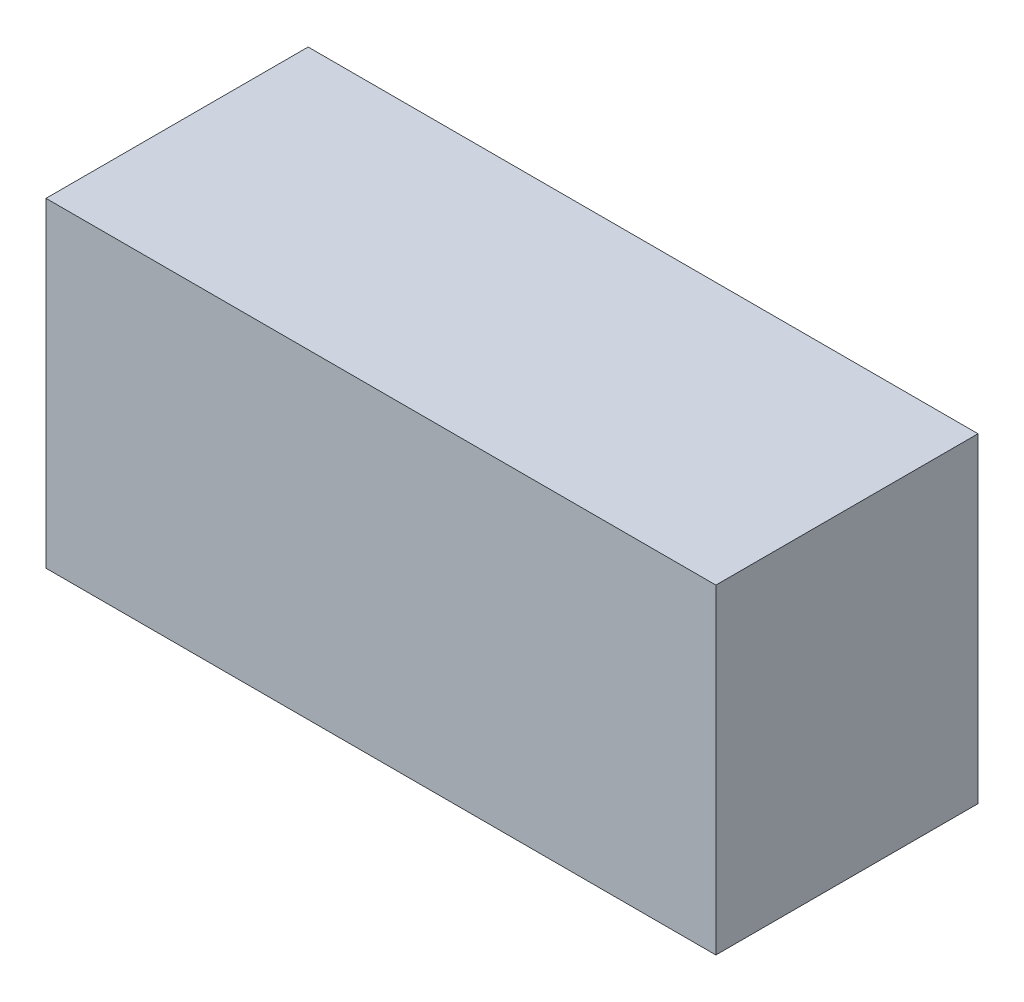
ISO-10303-21;
HEADER;
FILE_DESCRIPTION(('STEP AP214'),'2;1');
FILE_NAME('part.step','',(''),(''),'','','');
FILE_SCHEMA(('AUTOMOTIVE_DESIGN { 1 0 10303 214 1 1 1 1 }'));
ENDSEC;
DATA;
#1=APPLICATION_CONTEXT('core data for automotive mechanical design processes');
#2=APPLICATION_PROTOCOL_DEFINITION('international standard','automotive_design',2000,#1);
#3=PRODUCT_CONTEXT('',#1,'mechanical');
#4=PRODUCT('Part','Part','',(#3));
#5=PRODUCT_RELATED_PRODUCT_CATEGORY('part','',(#4));
#6=PRODUCT_DEFINITION_FORMATION('','',#4);
#7=PRODUCT_DEFINITION_CONTEXT('part definition',#1,'design');
#8=PRODUCT_DEFINITION('design','',#6,#7);
#9=PRODUCT_DEFINITION_SHAPE('','',#8);
#10=(LENGTH_UNIT() NAMED_UNIT(*) SI_UNIT(.MILLI.,.METRE.));
#11=(NAMED_UNIT(*) PLANE_ANGLE_UNIT() SI_UNIT($,.RADIAN.));
#12=(NAMED_UNIT(*) SI_UNIT($,.STERADIAN.) SOLID_ANGLE_UNIT());
#13=UNCERTAINTY_MEASURE_WITH_UNIT(LENGTH_MEASURE(1.E-05),#10,'distance_accuracy_value','');
#14=(GEOMETRIC_REPRESENTATION_CONTEXT(3) GLOBAL_UNCERTAINTY_ASSIGNED_CONTEXT((#13)) GLOBAL_UNIT_ASSIGNED_CONTEXT((#10,
#11,#12)) REPRESENTATION_CONTEXT('',''));
#15=CARTESIAN_POINT('',(0.,0.,0.));
#16=DIRECTION('',(0.,0.,1.));
#17=DIRECTION('',(1.,0.,0.));
#18=AXIS2_PLACEMENT_3D('',#15,#16,#17);
#19=CARTESIAN_POINT('',(1.15000024,0.5499989,0.90000074));
#20=DIRECTION('',(0.,0.,1.));
#21=DIRECTION('',(1.,0.,0.));
#22=AXIS2_PLACEMENT_3D('',#19,#20,#21);
#23=PLANE('',#22);
#24=DIRECTION('',(1.,0.,0.));
#25=VECTOR('',#24,1.);
#26=CARTESIAN_POINT('',(1.15000024,-0.5499989,0.90000074));
#27=LINE('',#26,#25);
#28=CARTESIAN_POINT('',(1.15000024,-0.5499989,0.90000074));
#29=VERTEX_POINT('',#28);
#30=CARTESIAN_POINT('',(-1.15000024,-0.5499989,0.90000074));
#31=VERTEX_POINT('',#30);
#32=EDGE_CURVE('E52',#29,#31,#27,.F.);
#33=ORIENTED_EDGE('',*,*,#32,.F.);
#34=DIRECTION('',(0.,1.,0.));
#35=VECTOR('',#34,1.);
#36=CARTESIAN_POINT('',(1.15000024,0.5499989,0.90000074));
#37=LINE('',#36,#35);
#38=CARTESIAN_POINT('',(1.15000024,0.5499989,0.90000074));
#39=VERTEX_POINT('',#38);
#40=EDGE_CURVE('E19',#29,#39,#37,.T.);
#41=ORIENTED_EDGE('',*,*,#40,.T.);
#42=DIRECTION('',(1.,0.,0.));
#43=VECTOR('',#42,1.);
#44=CARTESIAN_POINT('',(-1.15000024,0.5499989,0.90000074));
#45=LINE('',#44,#43);
#46=CARTESIAN_POINT('',(-1.15000024,0.5499989,0.90000074));
#47=VERTEX_POINT('',#46);
#48=EDGE_CURVE('E66',#47,#39,#45,.T.);
#49=ORIENTED_EDGE('',*,*,#48,.F.);
#50=DIRECTION('',(0.,1.,0.));
#51=VECTOR('',#50,1.);
#52=CARTESIAN_POINT('',(-1.15000024,-0.5499989,0.90000074));
#53=LINE('',#52,#51);
#54=EDGE_CURVE('E57',#31,#47,#53,.T.);
#55=ORIENTED_EDGE('',*,*,#54,.F.);
#56=EDGE_LOOP('',(#33,#41,#49,#55));
#57=FACE_BOUND('',#56,.T.);
#58=ADVANCED_FACE('F16',(#57),#23,.T.);
#59=CARTESIAN_POINT('',(-1.15000024,0.5499989,0.));
#60=DIRECTION('',(0.,1.,0.));
#61=DIRECTION('',(0.,0.,1.));
#62=AXIS2_PLACEMENT_3D('',#59,#60,#61);
#63=PLANE('',#62);
#64=DIRECTION('',(0.,0.,-1.));
#65=VECTOR('',#64,1.);
#66=CARTESIAN_POINT('',(1.15000024,0.5499989,0.));
#67=LINE('',#66,#65);
#68=CARTESIAN_POINT('',(1.15000024,0.5499989,0.));
#69=VERTEX_POINT('',#68);
#70=EDGE_CURVE('E79',#69,#39,#67,.F.);
#71=ORIENTED_EDGE('',*,*,#70,.F.);
#72=DIRECTION('',(1.,0.,0.));
#73=VECTOR('',#72,1.);
#74=CARTESIAN_POINT('',(1.15000024,0.5499989,0.));
#75=LINE('',#74,#73);
#76=CARTESIAN_POINT('',(-1.15000024,0.5499989,0.));
#77=VERTEX_POINT('',#76);
#78=EDGE_CURVE('E74',#69,#77,#75,.F.);
#79=ORIENTED_EDGE('',*,*,#78,.T.);
#80=DIRECTION('',(0.,0.,1.));
#81=VECTOR('',#80,1.);
#82=CARTESIAN_POINT('',(-1.15000024,0.5499989,0.));
#83=LINE('',#82,#81);
#84=EDGE_CURVE('E62',#47,#77,#83,.F.);
#85=ORIENTED_EDGE('',*,*,#84,.F.);
#86=ORIENTED_EDGE('',*,*,#48,.T.);
#87=EDGE_LOOP('',(#71,#79,#85,#86));
#88=FACE_BOUND('',#87,.T.);
#89=ADVANCED_FACE('F73',(#88),#63,.T.);
#90=CARTESIAN_POINT('',(-1.15000024,-0.5499989,0.));
#91=DIRECTION('',(-1.,0.,0.));
#92=DIRECTION('',(0.,0.,1.));
#93=AXIS2_PLACEMENT_3D('',#90,#91,#92);
#94=PLANE('',#93);
#95=ORIENTED_EDGE('',*,*,#84,.T.);
#96=DIRECTION('',(0.,1.,0.));
#97=VECTOR('',#96,1.);
#98=CARTESIAN_POINT('',(-1.15000024,0.5499989,0.));
#99=LINE('',#98,#97);
#100=CARTESIAN_POINT('',(-1.15000024,-0.5499989,0.));
#101=VERTEX_POINT('',#100);
#102=EDGE_CURVE('E83',#77,#101,#99,.F.);
#103=ORIENTED_EDGE('',*,*,#102,.T.);
#104=DIRECTION('',(0.,0.,-1.));
#105=VECTOR('',#104,1.);
#106=CARTESIAN_POINT('',(-1.15000024,-0.5499989,0.));
#107=LINE('',#106,#105);
#108=EDGE_CURVE('E64',#31,#101,#107,.T.);
#109=ORIENTED_EDGE('',*,*,#108,.F.);
#110=ORIENTED_EDGE('',*,*,#54,.T.);
#111=EDGE_LOOP('',(#95,#103,#109,#110));
#112=FACE_BOUND('',#111,.T.);
#113=ADVANCED_FACE('F59',(#112),#94,.T.);
#114=CARTESIAN_POINT('',(1.15000024,-0.5499989,0.));
#115=DIRECTION('',(0.,-1.,0.));
#116=DIRECTION('',(0.,0.,-1.));
#117=AXIS2_PLACEMENT_3D('',#114,#115,#116);
#118=PLANE('',#117);
#119=ORIENTED_EDGE('',*,*,#108,.T.);
#120=DIRECTION('',(1.,0.,0.));
#121=VECTOR('',#120,1.);
#122=CARTESIAN_POINT('',(1.15000024,-0.5499989,0.));
#123=LINE('',#122,#121);
#124=CARTESIAN_POINT('',(1.15000024,-0.5499989,0.));
#125=VERTEX_POINT('',#124);
#126=EDGE_CURVE('E25',#101,#125,#123,.T.);
#127=ORIENTED_EDGE('',*,*,#126,.T.);
#128=DIRECTION('',(0.,0.,-1.));
#129=VECTOR('',#128,1.);
#130=CARTESIAN_POINT('',(1.15000024,-0.5499989,0.));
#131=LINE('',#130,#129);
#132=EDGE_CURVE('E33',#29,#125,#131,.T.);
#133=ORIENTED_EDGE('',*,*,#132,.F.);
#134=ORIENTED_EDGE('',*,*,#32,.T.);
#135=EDGE_LOOP('',(#119,#127,#133,#134));
#136=FACE_BOUND('',#135,.T.);
#137=ADVANCED_FACE('F87',(#136),#118,.T.);
#138=CARTESIAN_POINT('',(1.15000024,0.5499989,0.));
#139=DIRECTION('',(1.,0.,0.));
#140=DIRECTION('',(0.,0.,-1.));
#141=AXIS2_PLACEMENT_3D('',#138,#139,#140);
#142=PLANE('',#141);
#143=ORIENTED_EDGE('',*,*,#132,.T.);
#144=DIRECTION('',(0.,1.,0.));
#145=VECTOR('',#144,1.);
#146=CARTESIAN_POINT('',(1.15000024,0.5499989,0.));
#147=LINE('',#146,#145);
#148=EDGE_CURVE('E11',#125,#69,#147,.T.);
#149=ORIENTED_EDGE('',*,*,#148,.T.);
#150=ORIENTED_EDGE('',*,*,#70,.T.);
#151=ORIENTED_EDGE('',*,*,#40,.F.);
#152=EDGE_LOOP('',(#143,#149,#150,#151));
#153=FACE_BOUND('',#152,.T.);
#154=ADVANCED_FACE('F90',(#153),#142,.T.);
#155=CARTESIAN_POINT('',(1.15000024,0.5499989,0.));
#156=DIRECTION('',(0.,0.,1.));
#157=DIRECTION('',(1.,0.,0.));
#158=AXIS2_PLACEMENT_3D('',#155,#156,#157);
#159=PLANE('',#158);
#160=ORIENTED_EDGE('',*,*,#126,.F.);
#161=ORIENTED_EDGE('',*,*,#102,.F.);
#162=ORIENTED_EDGE('',*,*,#78,.F.);
#163=ORIENTED_EDGE('',*,*,#148,.F.);
#164=EDGE_LOOP('',(#160,#161,#162,#163));
#165=FACE_BOUND('',#164,.T.);
#166=ADVANCED_FACE('F89',(#165),#159,.F.);
#167=CLOSED_SHELL('',(#58,#89,#113,#137,#154,#166));
#168=MANIFOLD_SOLID_BREP('B1',#167);
#169=ADVANCED_BREP_SHAPE_REPRESENTATION('',(#18,#168),#14);
#170=SHAPE_DEFINITION_REPRESENTATION(#9,#169);
ENDSEC;
END-ISO-10303-21;
